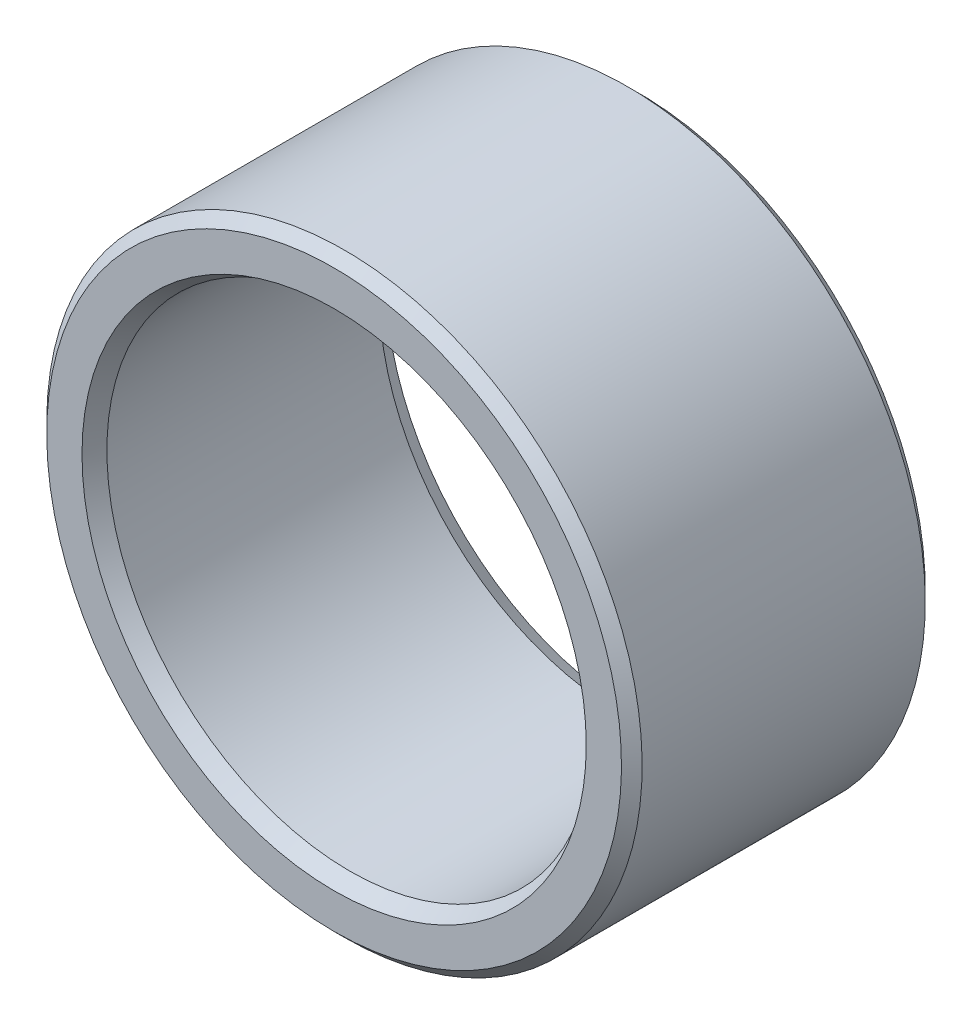
ISO-10303-21;
HEADER;
FILE_DESCRIPTION(('STEP AP214'),'2;1');
FILE_NAME('part.step','',(''),(''),'','','');
FILE_SCHEMA(('AUTOMOTIVE_DESIGN { 1 0 10303 214 1 1 1 1 }'));
ENDSEC;
DATA;
#1=APPLICATION_CONTEXT('core data for automotive mechanical design processes');
#2=APPLICATION_PROTOCOL_DEFINITION('international standard','automotive_design',2000,#1);
#3=PRODUCT_CONTEXT('',#1,'mechanical');
#4=PRODUCT('Part','Part','',(#3));
#5=PRODUCT_RELATED_PRODUCT_CATEGORY('part','',(#4));
#6=PRODUCT_DEFINITION_FORMATION('','',#4);
#7=PRODUCT_DEFINITION_CONTEXT('part definition',#1,'design');
#8=PRODUCT_DEFINITION('design','',#6,#7);
#9=PRODUCT_DEFINITION_SHAPE('','',#8);
#10=(LENGTH_UNIT() NAMED_UNIT(*) SI_UNIT(.MILLI.,.METRE.));
#11=(NAMED_UNIT(*) PLANE_ANGLE_UNIT() SI_UNIT($,.RADIAN.));
#12=(NAMED_UNIT(*) SI_UNIT($,.STERADIAN.) SOLID_ANGLE_UNIT());
#13=UNCERTAINTY_MEASURE_WITH_UNIT(LENGTH_MEASURE(1.E-05),#10,'distance_accuracy_value','');
#14=(GEOMETRIC_REPRESENTATION_CONTEXT(3) GLOBAL_UNCERTAINTY_ASSIGNED_CONTEXT((#13)) GLOBAL_UNIT_ASSIGNED_CONTEXT((#10,
#11,#12)) REPRESENTATION_CONTEXT('',''));
#15=CARTESIAN_POINT('',(0.,0.,0.));
#16=DIRECTION('',(0.,0.,1.));
#17=DIRECTION('',(1.,0.,0.));
#18=AXIS2_PLACEMENT_3D('',#15,#16,#17);
#19=CARTESIAN_POINT('',(0.,0.,0.3));
#20=DIRECTION('',(0.,0.,-1.));
#21=DIRECTION('',(0.,1.,0.));
#22=AXIS2_PLACEMENT_3D('',#19,#20,#21);
#23=CYLINDRICAL_SURFACE('',#22,4.9);
#24=CARTESIAN_POINT('',(0.,0.,4.83000000001));
#25=DIRECTION('',(0.,0.,-1.));
#26=DIRECTION('',(0.,-1.,0.));
#27=AXIS2_PLACEMENT_3D('',#24,#25,#26);
#28=CIRCLE('',#27,4.90000000001);
#29=CARTESIAN_POINT('',(0.,-4.90000000001,4.83000000001));
#30=VERTEX_POINT('',#29);
#31=EDGE_CURVE('E67',#30,#30,#28,.T.);
#32=ORIENTED_EDGE('',*,*,#31,.T.);
#33=EDGE_LOOP('',(#32));
#34=FACE_BOUND('',#33,.T.);
#35=CARTESIAN_POINT('',(0.,0.,0.170000000010003));
#36=DIRECTION('',(0.,0.,1.));
#37=DIRECTION('',(0.,-1.,0.));
#38=AXIS2_PLACEMENT_3D('',#35,#36,#37);
#39=CIRCLE('',#38,4.90000000001);
#40=CARTESIAN_POINT('',(0.,-4.90000000001,0.170000000010003));
#41=VERTEX_POINT('',#40);
#42=EDGE_CURVE('E11',#41,#41,#39,.T.);
#43=ORIENTED_EDGE('',*,*,#42,.T.);
#44=EDGE_LOOP('',(#43));
#45=FACE_BOUND('',#44,.T.);
#46=ADVANCED_FACE('F17',(#34,#45),#23,.T.);
#47=CARTESIAN_POINT('',(0.,0.,0.));
#48=DIRECTION('',(0.,0.,1.));
#49=DIRECTION('',(0.,-1.,0.));
#50=AXIS2_PLACEMENT_3D('',#47,#48,#49);
#51=CONICAL_SURFACE('',#50,4.73,0.78539816339745);
#52=CARTESIAN_POINT('',(0.,0.,0.));
#53=DIRECTION('',(0.,0.,-1.));
#54=DIRECTION('',(0.,-1.,0.));
#55=AXIS2_PLACEMENT_3D('',#52,#53,#54);
#56=CIRCLE('',#55,4.73000000001);
#57=CARTESIAN_POINT('',(0.,-4.73000000001,0.));
#58=VERTEX_POINT('',#57);
#59=EDGE_CURVE('E20',#58,#58,#56,.T.);
#60=ORIENTED_EDGE('',*,*,#59,.F.);
#61=EDGE_LOOP('',(#60));
#62=FACE_BOUND('',#61,.T.);
#63=ORIENTED_EDGE('',*,*,#42,.F.);
#64=EDGE_LOOP('',(#63));
#65=FACE_BOUND('',#64,.T.);
#66=ADVANCED_FACE('F162',(#62,#65),#51,.T.);
#67=CARTESIAN_POINT('',(0.,0.,0.));
#68=DIRECTION('',(0.,0.,1.));
#69=DIRECTION('',(1.,0.,0.));
#70=AXIS2_PLACEMENT_3D('',#67,#68,#69);
#71=PLANE('',#70);
#72=CARTESIAN_POINT('',(0.,0.,0.));
#73=DIRECTION('',(0.,0.,1.));
#74=DIRECTION('',(0.,-1.,0.));
#75=AXIS2_PLACEMENT_3D('',#72,#73,#74);
#76=CIRCLE('',#75,4.15000000000999);
#77=CARTESIAN_POINT('',(0.,-4.15000000000999,0.));
#78=VERTEX_POINT('',#77);
#79=EDGE_CURVE('E78',#78,#78,#76,.T.);
#80=ORIENTED_EDGE('',*,*,#79,.T.);
#81=EDGE_LOOP('',(#80));
#82=FACE_BOUND('',#81,.T.);
#83=ORIENTED_EDGE('',*,*,#59,.T.);
#84=EDGE_LOOP('',(#83));
#85=FACE_BOUND('',#84,.T.);
#86=ADVANCED_FACE('F150',(#82,#85),#71,.F.);
#87=CARTESIAN_POINT('',(0.,0.,0.));
#88=DIRECTION('',(0.,0.,-1.));
#89=DIRECTION('',(0.,1.,0.));
#90=AXIS2_PLACEMENT_3D('',#87,#88,#89);
#91=CONICAL_SURFACE('',#90,4.15,0.523598775598299);
#92=CARTESIAN_POINT('',(0.,0.,0.259807621145323));
#93=DIRECTION('',(0.,0.,-1.));
#94=DIRECTION('',(0.,-1.,0.));
#95=AXIS2_PLACEMENT_3D('',#92,#93,#94);
#96=CIRCLE('',#95,4.00000000001);
#97=CARTESIAN_POINT('',(0.,-4.00000000001,0.259807621145323));
#98=VERTEX_POINT('',#97);
#99=EDGE_CURVE('E70',#98,#98,#96,.T.);
#100=ORIENTED_EDGE('',*,*,#99,.F.);
#101=EDGE_LOOP('',(#100));
#102=FACE_BOUND('',#101,.T.);
#103=ORIENTED_EDGE('',*,*,#79,.F.);
#104=EDGE_LOOP('',(#103));
#105=FACE_BOUND('',#104,.T.);
#106=ADVANCED_FACE('F139',(#102,#105),#91,.F.);
#107=CARTESIAN_POINT('',(0.,0.,0.));
#108=DIRECTION('',(0.,0.,1.));
#109=DIRECTION('',(0.,-1.,0.));
#110=AXIS2_PLACEMENT_3D('',#107,#108,#109);
#111=CYLINDRICAL_SURFACE('',#110,4.);
#112=ORIENTED_EDGE('',*,*,#99,.T.);
#113=EDGE_LOOP('',(#112));
#114=FACE_BOUND('',#113,.T.);
#115=CARTESIAN_POINT('',(0.,0.,4.74019237887466));
#116=DIRECTION('',(0.,0.,1.));
#117=DIRECTION('',(0.,-1.,0.));
#118=AXIS2_PLACEMENT_3D('',#115,#116,#117);
#119=CIRCLE('',#118,4.00000000001);
#120=CARTESIAN_POINT('',(0.,-4.00000000001,4.74019237887466));
#121=VERTEX_POINT('',#120);
#122=EDGE_CURVE('E80',#121,#121,#119,.T.);
#123=ORIENTED_EDGE('',*,*,#122,.T.);
#124=EDGE_LOOP('',(#123));
#125=FACE_BOUND('',#124,.T.);
#126=ADVANCED_FACE('F128',(#114,#125),#111,.F.);
#127=CARTESIAN_POINT('',(0.,0.,5.));
#128=DIRECTION('',(0.,0.,-1.));
#129=DIRECTION('',(0.,1.,0.));
#130=AXIS2_PLACEMENT_3D('',#127,#128,#129);
#131=CONICAL_SURFACE('',#130,4.73,0.785398163397446);
#132=CARTESIAN_POINT('',(0.,0.,5.00000000001));
#133=DIRECTION('',(0.,0.,1.));
#134=DIRECTION('',(0.,-1.,0.));
#135=AXIS2_PLACEMENT_3D('',#132,#133,#134);
#136=CIRCLE('',#135,4.73000000001);
#137=CARTESIAN_POINT('',(0.,-4.73000000001,5.00000000001));
#138=VERTEX_POINT('',#137);
#139=EDGE_CURVE('E71',#138,#138,#136,.T.);
#140=ORIENTED_EDGE('',*,*,#139,.F.);
#141=EDGE_LOOP('',(#140));
#142=FACE_BOUND('',#141,.T.);
#143=ORIENTED_EDGE('',*,*,#31,.F.);
#144=EDGE_LOOP('',(#143));
#145=FACE_BOUND('',#144,.T.);
#146=ADVANCED_FACE('F117',(#142,#145),#131,.T.);
#147=CARTESIAN_POINT('',(0.,0.,5.));
#148=DIRECTION('',(0.,0.,1.));
#149=DIRECTION('',(1.,0.,0.));
#150=AXIS2_PLACEMENT_3D('',#147,#148,#149);
#151=PLANE('',#150);
#152=CARTESIAN_POINT('',(0.,0.,5.00000000001));
#153=DIRECTION('',(0.,0.,-1.));
#154=DIRECTION('',(0.,-1.,0.));
#155=AXIS2_PLACEMENT_3D('',#152,#153,#154);
#156=CIRCLE('',#155,4.15000000001001);
#157=CARTESIAN_POINT('',(0.,-4.15000000001001,5.00000000001));
#158=VERTEX_POINT('',#157);
#159=EDGE_CURVE('E274',#158,#158,#156,.T.);
#160=ORIENTED_EDGE('',*,*,#159,.T.);
#161=EDGE_LOOP('',(#160));
#162=FACE_BOUND('',#161,.T.);
#163=ORIENTED_EDGE('',*,*,#139,.T.);
#164=EDGE_LOOP('',(#163));
#165=FACE_BOUND('',#164,.T.);
#166=ADVANCED_FACE('F105',(#162,#165),#151,.T.);
#167=CARTESIAN_POINT('',(0.,0.,4.74019237886466));
#168=DIRECTION('',(0.,0.,1.));
#169=DIRECTION('',(0.,-1.,0.));
#170=AXIS2_PLACEMENT_3D('',#167,#168,#169);
#171=CONICAL_SURFACE('',#170,4.,0.523598775598299);
#172=ORIENTED_EDGE('',*,*,#122,.F.);
#173=EDGE_LOOP('',(#172));
#174=FACE_BOUND('',#173,.T.);
#175=ORIENTED_EDGE('',*,*,#159,.F.);
#176=EDGE_LOOP('',(#175));
#177=FACE_BOUND('',#176,.T.);
#178=ADVANCED_FACE('F100',(#174,#177),#171,.F.);
#179=CLOSED_SHELL('',(#46,#66,#86,#106,#126,#146,#166,#178));
#180=MANIFOLD_SOLID_BREP('B1',#179);
#181=ADVANCED_BREP_SHAPE_REPRESENTATION('',(#18,#180),#14);
#182=SHAPE_DEFINITION_REPRESENTATION(#9,#181);
ENDSEC;
END-ISO-10303-21;
